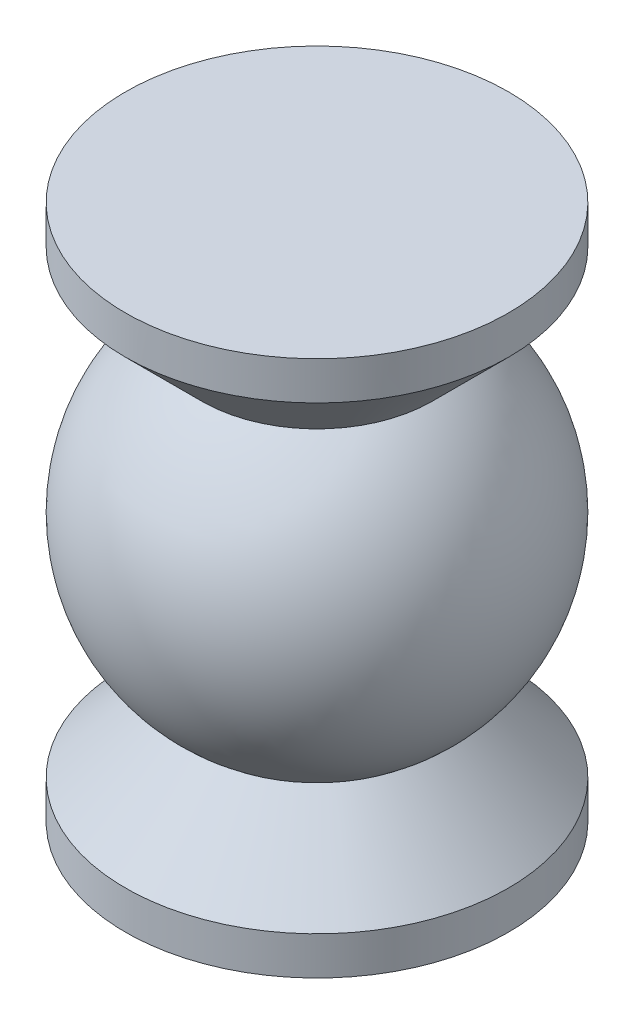
ISO-10303-21;
HEADER;
FILE_DESCRIPTION(('STEP AP214'),'2;1');
FILE_NAME('part.step','',(''),(''),'','','');
FILE_SCHEMA(('AUTOMOTIVE_DESIGN { 1 0 10303 214 1 1 1 1 }'));
ENDSEC;
DATA;
#1=APPLICATION_CONTEXT('core data for automotive mechanical design processes');
#2=APPLICATION_PROTOCOL_DEFINITION('international standard','automotive_design',2000,#1);
#3=PRODUCT_CONTEXT('',#1,'mechanical');
#4=PRODUCT('Part','Part','',(#3));
#5=PRODUCT_RELATED_PRODUCT_CATEGORY('part','',(#4));
#6=PRODUCT_DEFINITION_FORMATION('','',#4);
#7=PRODUCT_DEFINITION_CONTEXT('part definition',#1,'design');
#8=PRODUCT_DEFINITION('design','',#6,#7);
#9=PRODUCT_DEFINITION_SHAPE('','',#8);
#10=(LENGTH_UNIT() NAMED_UNIT(*) SI_UNIT(.MILLI.,.METRE.));
#11=(NAMED_UNIT(*) PLANE_ANGLE_UNIT() SI_UNIT($,.RADIAN.));
#12=(NAMED_UNIT(*) SI_UNIT($,.STERADIAN.) SOLID_ANGLE_UNIT());
#13=UNCERTAINTY_MEASURE_WITH_UNIT(LENGTH_MEASURE(1.E-05),#10,'distance_accuracy_value','');
#14=(GEOMETRIC_REPRESENTATION_CONTEXT(3) GLOBAL_UNCERTAINTY_ASSIGNED_CONTEXT((#13)) GLOBAL_UNIT_ASSIGNED_CONTEXT((#10,
#11,#12)) REPRESENTATION_CONTEXT('',''));
#15=CARTESIAN_POINT('',(0.,0.,0.));
#16=DIRECTION('',(0.,0.,1.));
#17=DIRECTION('',(1.,0.,0.));
#18=AXIS2_PLACEMENT_3D('',#15,#16,#17);
#19=CARTESIAN_POINT('',(0.,0.,0.));
#20=DIRECTION('',(0.,-1.,0.));
#21=DIRECTION('',(0.,0.,-1.));
#22=AXIS2_PLACEMENT_3D('',#19,#20,#21);
#23=PLANE('',#22);
#24=CARTESIAN_POINT('',(0.,0.,0.));
#25=DIRECTION('',(0.,-1.,0.));
#26=DIRECTION('',(0.,0.,-1.));
#27=AXIS2_PLACEMENT_3D('',#24,#25,#26);
#28=CIRCLE('',#27,25.);
#29=CARTESIAN_POINT('',(0.,0.,-25.));
#30=VERTEX_POINT('',#29);
#31=EDGE_CURVE('E10',#30,#30,#28,.T.);
#32=ORIENTED_EDGE('',*,*,#31,.T.);
#33=EDGE_LOOP('',(#32));
#34=FACE_BOUND('',#33,.T.);
#35=ADVANCED_FACE('F37',(#34),#23,.T.);
#36=CARTESIAN_POINT('',(0.,0.,0.));
#37=DIRECTION('',(0.,-1.,0.));
#38=DIRECTION('',(0.,0.,-1.));
#39=AXIS2_PLACEMENT_3D('',#36,#37,#38);
#40=CYLINDRICAL_SURFACE('',#39,25.);
#41=CARTESIAN_POINT('',(0.,5.,0.));
#42=DIRECTION('',(0.,-1.,0.));
#43=DIRECTION('',(0.,0.,-1.));
#44=AXIS2_PLACEMENT_3D('',#41,#42,#43);
#45=CIRCLE('',#44,25.);
#46=CARTESIAN_POINT('',(0.,5.,-25.));
#47=VERTEX_POINT('',#46);
#48=EDGE_CURVE('E43',#47,#47,#45,.T.);
#49=ORIENTED_EDGE('',*,*,#48,.T.);
#50=EDGE_LOOP('',(#49));
#51=FACE_BOUND('',#50,.T.);
#52=ORIENTED_EDGE('',*,*,#31,.F.);
#53=EDGE_LOOP('',(#52));
#54=FACE_BOUND('',#53,.T.);
#55=ADVANCED_FACE('F75',(#51,#54),#40,.T.);
#56=CARTESIAN_POINT('',(0.,5.,0.));
#57=DIRECTION('',(0.,-1.,0.));
#58=DIRECTION('',(0.,0.,-1.));
#59=AXIS2_PLACEMENT_3D('',#56,#57,#58);
#60=CONICAL_SURFACE('',#59,25.,0.785398163397449);
#61=CARTESIAN_POINT('',(0.,15.,0.));
#62=DIRECTION('',(0.,-1.,0.));
#63=DIRECTION('',(0.,0.,-1.));
#64=AXIS2_PLACEMENT_3D('',#61,#62,#63);
#65=CIRCLE('',#64,15.);
#66=CARTESIAN_POINT('',(15.,15.,0.));
#67=VERTEX_POINT('',#66);
#68=EDGE_CURVE('E47',#67,#67,#65,.T.);
#69=ORIENTED_EDGE('',*,*,#68,.T.);
#70=EDGE_LOOP('',(#69));
#71=FACE_BOUND('',#70,.T.);
#72=ORIENTED_EDGE('',*,*,#48,.F.);
#73=EDGE_LOOP('',(#72));
#74=FACE_BOUND('',#73,.T.);
#75=ADVANCED_FACE('F79',(#71,#74),#60,.T.);
#76=CARTESIAN_POINT('',(0.,35.,0.));
#77=DIRECTION('',(0.,-1.,0.));
#78=DIRECTION('',(1.,0.,0.));
#79=AXIS2_PLACEMENT_3D('',#76,#77,#78);
#80=SPHERICAL_SURFACE('',#79,25.);
#81=CARTESIAN_POINT('',(0.,55.,0.));
#82=DIRECTION('',(0.,-1.,0.));
#83=DIRECTION('',(0.,0.,-1.));
#84=AXIS2_PLACEMENT_3D('',#81,#82,#83);
#85=CIRCLE('',#84,15.);
#86=CARTESIAN_POINT('',(15.,55.,0.));
#87=VERTEX_POINT('',#86);
#88=EDGE_CURVE('E51',#87,#87,#85,.T.);
#89=CARTESIAN_POINT('',(15.,55.,0.));
#90=CARTESIAN_POINT('',(15.386383877575,54.7102331585329,0.));
#91=CARTESIAN_POINT('',(15.764349304277,54.4092445387064,0.));
#92=CARTESIAN_POINT('',(16.5022218904126,53.785891059142,0.));
#93=CARTESIAN_POINT('',(16.8621290498462,53.4635261994041,0.));
#94=CARTESIAN_POINT('',(17.5626637359227,52.798487556824,0.));
#95=CARTESIAN_POINT('',(17.9032912625656,52.4558137739817,0.));
#96=CARTESIAN_POINT('',(18.5641263057405,51.751312031891,0.));
#97=CARTESIAN_POINT('',(18.8843338222726,51.3894840726425,0.));
#98=CARTESIAN_POINT('',(19.5032526836538,50.6478878896459,0.));
#99=CARTESIAN_POINT('',(19.8019640285029,50.2681196658977,0.));
#100=CARTESIAN_POINT('',(20.3768877346254,49.4919184892619,0.));
#101=CARTESIAN_POINT('',(20.6531000958988,49.0954855363742,0.));
#102=CARTESIAN_POINT('',(21.1820982609088,48.2872860261715,0.));
#103=CARTESIAN_POINT('',(21.4348840646454,47.8755194688565,0.));
#104=CARTESIAN_POINT('',(21.9161802896365,47.0380354631662,0.));
#105=CARTESIAN_POINT('',(22.1446907108911,46.6123180147909,0.));
#106=CARTESIAN_POINT('',(22.5766688391047,45.748361760207,0.));
#107=CARTESIAN_POINT('',(22.7801365460637,45.3101229539983,0.));
#108=CARTESIAN_POINT('',(23.1613460121235,44.4225955702136,0.));
#109=CARTESIAN_POINT('',(23.3390877712243,43.9733069926376,0.));
#110=CARTESIAN_POINT('',(23.6682484928968,43.065188755281,0.));
#111=CARTESIAN_POINT('',(23.8196674554685,42.6063590955005,0.));
#112=CARTESIAN_POINT('',(24.0956741265362,41.6806994219065,0.));
#113=CARTESIAN_POINT('',(24.2202618350321,41.2138694080932,0.));
#114=CARTESIAN_POINT('',(24.4421876383544,40.2737766192749,0.));
#115=CARTESIAN_POINT('',(24.5395257331807,39.80051384427,0.));
#116=CARTESIAN_POINT('',(24.7066254525011,38.8491447268512,0.));
#117=CARTESIAN_POINT('',(24.7763870769951,38.3710383844373,0.));
#118=CARTESIAN_POINT('',(24.8880995994487,37.411587590441,0.));
#119=CARTESIAN_POINT('',(24.9300504974084,36.9302431388586,0.));
#120=CARTESIAN_POINT('',(24.9860006976841,35.9659324581841,0.));
#121=CARTESIAN_POINT('',(25.,35.482966229092,0.));
#122=CARTESIAN_POINT('',(25.,34.517033770908,0.));
#123=CARTESIAN_POINT('',(24.9860006976841,34.0340675418159,0.));
#124=CARTESIAN_POINT('',(24.9300504974084,33.0697568611415,0.));
#125=CARTESIAN_POINT('',(24.8880995994487,32.588412409559,0.));
#126=CARTESIAN_POINT('',(24.7763870769951,31.6289616155627,0.));
#127=CARTESIAN_POINT('',(24.7066254525011,31.1508552731488,0.));
#128=CARTESIAN_POINT('',(24.5395257331807,30.19948615573,0.));
#129=CARTESIAN_POINT('',(24.4421876383544,29.7262233807251,0.));
#130=CARTESIAN_POINT('',(24.2202618350321,28.7861305919069,0.));
#131=CARTESIAN_POINT('',(24.0956741265362,28.3193005780935,0.));
#132=CARTESIAN_POINT('',(23.8196674554685,27.3936409044996,0.));
#133=CARTESIAN_POINT('',(23.6682484928968,26.934811244719,0.));
#134=CARTESIAN_POINT('',(23.3390877712243,26.0266930073624,0.));
#135=CARTESIAN_POINT('',(23.1613460121235,25.5774044297864,0.));
#136=CARTESIAN_POINT('',(22.7801365460637,24.6898770460017,0.));
#137=CARTESIAN_POINT('',(22.5766688391047,24.251638239793,0.));
#138=CARTESIAN_POINT('',(22.1446907108911,23.3876819852091,0.));
#139=CARTESIAN_POINT('',(21.9161802896365,22.9619645368338,0.));
#140=CARTESIAN_POINT('',(21.4348840646454,22.1244805311435,0.));
#141=CARTESIAN_POINT('',(21.1820982609088,21.7127139738285,0.));
#142=CARTESIAN_POINT('',(20.6531000958988,20.9045144636258,0.));
#143=CARTESIAN_POINT('',(20.3768877346255,20.5080815107381,0.));
#144=CARTESIAN_POINT('',(19.8019640285029,19.7318803341023,0.));
#145=CARTESIAN_POINT('',(19.5032526836538,19.3521121103541,0.));
#146=CARTESIAN_POINT('',(18.8843338222726,18.6105159273575,0.));
#147=CARTESIAN_POINT('',(18.5641263057405,18.248687968109,0.));
#148=CARTESIAN_POINT('',(17.9032912625656,17.5441862260183,0.));
#149=CARTESIAN_POINT('',(17.5626637359227,17.2015124431761,0.));
#150=CARTESIAN_POINT('',(16.8621290498462,16.5364738005959,0.));
#151=CARTESIAN_POINT('',(16.5022218904126,16.214108940858,0.));
#152=CARTESIAN_POINT('',(15.764349304277,15.5907554612936,0.));
#153=CARTESIAN_POINT('',(15.386383877575,15.2897668414672,0.));
#154=CARTESIAN_POINT('',(15.,15.,0.));
#155=B_SPLINE_CURVE_WITH_KNOTS('',3,(#89,#90,#91,#92,#93,#94,#95,#96,#97,#98,#99,#100,#101,#102,
#103,#104,#105,#106,#107,#108,#109,#110,#111,#112,#113,#114,#115,#116,#117,#118,#119,#120,#121,
#122,#123,#124,#125,#126,#127,#128,#129,#130,#131,#132,#133,#134,#135,#136,#137,#138,#139,#140,
#141,#142,#143,#144,#145,#146,#147,#148,#149,#150,#151,#152,#153,#154),.UNSPECIFIED.,.F.,.F.,(4,
2,2,2,2,2,2,2,2,2,2,2,2,2,2,2,2,2,2,2,2,2,2,2,2,2,2,2,2,2,2,2,4),(0.,1.44869600768679,
2.89739201537359,4.34608802306038,5.79478403074718,7.24348003843398,8.69217604612078,
10.1408720538076,11.5895680614944,13.0382640691812,14.486960076868,15.9356560845548,
17.3843520922416,18.8330480999284,20.2817441076152,21.730440115302,23.1791361229888,
24.6278321306755,26.0765281383623,27.5252241460491,28.9739201537359,30.4226161614227,
31.8713121691095,33.3200081767963,34.7687041844831,36.2174001921699,37.6660961998567,
39.1147922075435,40.5634882152303,42.0121842229171,43.4608802306039,44.9095762382907,
46.3582722459775),.UNSPECIFIED.);
#156=EDGE_CURVE('BSEAM83',#87,#67,#155,.T.);
#157=ORIENTED_EDGE('',*,*,#88,.T.);
#158=ORIENTED_EDGE('',*,*,#68,.F.);
#159=ORIENTED_EDGE('',*,*,#156,.T.);
#160=ORIENTED_EDGE('',*,*,#156,.F.);
#161=EDGE_LOOP('',(#157,#159,#158,#160));
#162=FACE_BOUND('',#161,.T.);
#163=ADVANCED_FACE('F83',(#162),#80,.T.);
#164=CARTESIAN_POINT('',(0.,55.,0.));
#165=DIRECTION('',(0.,1.,0.));
#166=DIRECTION('',(0.,0.,1.));
#167=AXIS2_PLACEMENT_3D('',#164,#165,#166);
#168=CONICAL_SURFACE('',#167,15.,0.785398163397449);
#169=CARTESIAN_POINT('',(0.,65.,0.));
#170=DIRECTION('',(0.,-1.,0.));
#171=DIRECTION('',(0.,0.,-1.));
#172=AXIS2_PLACEMENT_3D('',#169,#170,#171);
#173=CIRCLE('',#172,25.);
#174=CARTESIAN_POINT('',(0.,65.,-25.));
#175=VERTEX_POINT('',#174);
#176=EDGE_CURVE('E56',#175,#175,#173,.T.);
#177=ORIENTED_EDGE('',*,*,#176,.T.);
#178=EDGE_LOOP('',(#177));
#179=FACE_BOUND('',#178,.T.);
#180=ORIENTED_EDGE('',*,*,#88,.F.);
#181=EDGE_LOOP('',(#180));
#182=FACE_BOUND('',#181,.T.);
#183=ADVANCED_FACE('F72',(#179,#182),#168,.T.);
#184=CARTESIAN_POINT('',(0.,0.,0.));
#185=DIRECTION('',(0.,-1.,0.));
#186=DIRECTION('',(0.,0.,-1.));
#187=AXIS2_PLACEMENT_3D('',#184,#185,#186);
#188=CYLINDRICAL_SURFACE('',#187,25.);
#189=CARTESIAN_POINT('',(0.,70.,0.));
#190=DIRECTION('',(0.,-1.,0.));
#191=DIRECTION('',(0.,0.,-1.));
#192=AXIS2_PLACEMENT_3D('',#189,#190,#191);
#193=CIRCLE('',#192,25.);
#194=CARTESIAN_POINT('',(0.,70.,-25.));
#195=VERTEX_POINT('',#194);
#196=EDGE_CURVE('E59',#195,#195,#193,.T.);
#197=ORIENTED_EDGE('',*,*,#196,.T.);
#198=EDGE_LOOP('',(#197));
#199=FACE_BOUND('',#198,.T.);
#200=ORIENTED_EDGE('',*,*,#176,.F.);
#201=EDGE_LOOP('',(#200));
#202=FACE_BOUND('',#201,.T.);
#203=ADVANCED_FACE('F63',(#199,#202),#188,.T.);
#204=CARTESIAN_POINT('',(25.,70.,0.));
#205=DIRECTION('',(0.,1.,0.));
#206=DIRECTION('',(0.,0.,1.));
#207=AXIS2_PLACEMENT_3D('',#204,#205,#206);
#208=PLANE('',#207);
#209=ORIENTED_EDGE('',*,*,#196,.F.);
#210=EDGE_LOOP('',(#209));
#211=FACE_BOUND('',#210,.T.);
#212=ADVANCED_FACE('F66',(#211),#208,.T.);
#213=CLOSED_SHELL('',(#35,#55,#75,#163,#183,#203,#212));
#214=MANIFOLD_SOLID_BREP('B2',#213);
#215=ADVANCED_BREP_SHAPE_REPRESENTATION('',(#18,#214),#14);
#216=SHAPE_DEFINITION_REPRESENTATION(#9,#215);
ENDSEC;
END-ISO-10303-21;
